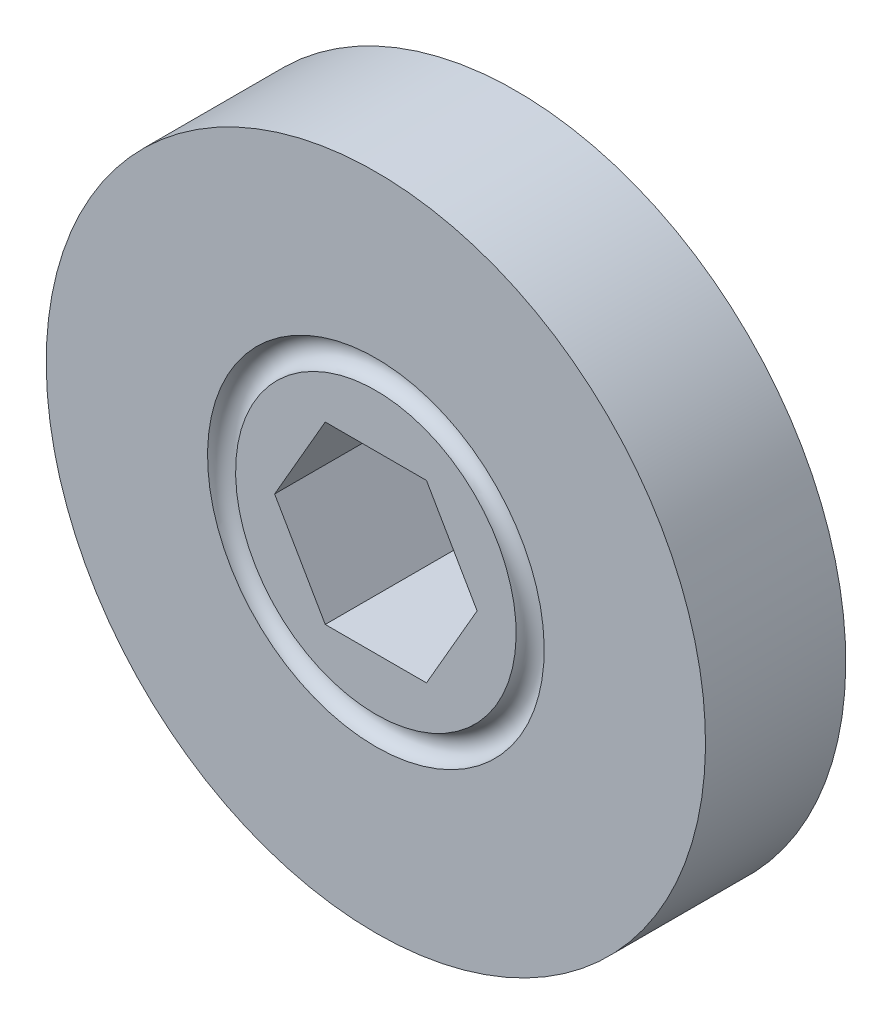
ISO-10303-21;
HEADER;
FILE_DESCRIPTION(('STEP AP214'),'2;1');
FILE_NAME('part.step','',(''),(''),'','','');
FILE_SCHEMA(('AUTOMOTIVE_DESIGN { 1 0 10303 214 1 1 1 1 }'));
ENDSEC;
DATA;
#1=APPLICATION_CONTEXT('core data for automotive mechanical design processes');
#2=APPLICATION_PROTOCOL_DEFINITION('international standard','automotive_design',2000,#1);
#3=PRODUCT_CONTEXT('',#1,'mechanical');
#4=PRODUCT('Part','Part','',(#3));
#5=PRODUCT_RELATED_PRODUCT_CATEGORY('part','',(#4));
#6=PRODUCT_DEFINITION_FORMATION('','',#4);
#7=PRODUCT_DEFINITION_CONTEXT('part definition',#1,'design');
#8=PRODUCT_DEFINITION('design','',#6,#7);
#9=PRODUCT_DEFINITION_SHAPE('','',#8);
#10=(LENGTH_UNIT() NAMED_UNIT(*) SI_UNIT(.MILLI.,.METRE.));
#11=(NAMED_UNIT(*) PLANE_ANGLE_UNIT() SI_UNIT($,.RADIAN.));
#12=(NAMED_UNIT(*) SI_UNIT($,.STERADIAN.) SOLID_ANGLE_UNIT());
#13=UNCERTAINTY_MEASURE_WITH_UNIT(LENGTH_MEASURE(1.E-05),#10,'distance_accuracy_value','');
#14=(GEOMETRIC_REPRESENTATION_CONTEXT(3) GLOBAL_UNCERTAINTY_ASSIGNED_CONTEXT((#13)) GLOBAL_UNIT_ASSIGNED_CONTEXT((#10,
#11,#12)) REPRESENTATION_CONTEXT('',''));
#15=CARTESIAN_POINT('',(0.,0.,0.));
#16=DIRECTION('',(0.,0.,1.));
#17=DIRECTION('',(1.,0.,0.));
#18=AXIS2_PLACEMENT_3D('',#15,#16,#17);
#19=CARTESIAN_POINT('',(0.,-0.253999999999998,-5.08));
#20=DIRECTION('',(0.,0.,-1.));
#21=DIRECTION('',(0.,1.,0.));
#22=AXIS2_PLACEMENT_3D('',#19,#20,#21);
#23=PLANE('',#22);
#24=CARTESIAN_POINT('',(0.,11.938,-5.08));
#25=DIRECTION('',(0.,0.,1.));
#26=DIRECTION('',(0.,-1.,0.));
#27=AXIS2_PLACEMENT_3D('',#24,#25,#26);
#28=CIRCLE('',#27,12.192);
#29=CARTESIAN_POINT('',(0.,-0.253999999999997,-5.08));
#30=VERTEX_POINT('',#29);
#31=EDGE_CURVE('E132',#30,#30,#28,.T.);
#32=ORIENTED_EDGE('',*,*,#31,.T.);
#33=EDGE_LOOP('',(#32));
#34=FACE_BOUND('',#33,.T.);
#35=CARTESIAN_POINT('',(0.,11.938,-5.08));
#36=DIRECTION('',(0.,0.,1.));
#37=DIRECTION('',(0.,-1.,0.));
#38=AXIS2_PLACEMENT_3D('',#35,#36,#37);
#39=CIRCLE('',#38,23.876);
#40=CARTESIAN_POINT('',(0.,-11.938,-5.08));
#41=VERTEX_POINT('',#40);
#42=EDGE_CURVE('E11',#41,#41,#39,.T.);
#43=ORIENTED_EDGE('',*,*,#42,.F.);
#44=EDGE_LOOP('',(#43));
#45=FACE_BOUND('',#44,.T.);
#46=ADVANCED_FACE('F33',(#34,#45),#23,.T.);
#47=CARTESIAN_POINT('',(0.,11.938,5.08));
#48=DIRECTION('',(0.,0.,1.));
#49=DIRECTION('',(0.,-1.,0.));
#50=AXIS2_PLACEMENT_3D('',#47,#48,#49);
#51=CYLINDRICAL_SURFACE('',#50,23.876);
#52=ORIENTED_EDGE('',*,*,#42,.T.);
#53=EDGE_LOOP('',(#52));
#54=FACE_BOUND('',#53,.T.);
#55=CARTESIAN_POINT('',(0.,11.938,5.08));
#56=DIRECTION('',(0.,0.,1.));
#57=DIRECTION('',(0.,-1.,0.));
#58=AXIS2_PLACEMENT_3D('',#55,#56,#57);
#59=CIRCLE('',#58,23.876);
#60=CARTESIAN_POINT('',(0.,-11.938,5.08));
#61=VERTEX_POINT('',#60);
#62=EDGE_CURVE('E40',#61,#61,#59,.T.);
#63=ORIENTED_EDGE('',*,*,#62,.F.);
#64=EDGE_LOOP('',(#63));
#65=FACE_BOUND('',#64,.T.);
#66=ADVANCED_FACE('F149',(#54,#65),#51,.T.);
#67=CARTESIAN_POINT('',(0.,-11.938,5.08));
#68=DIRECTION('',(0.,0.,1.));
#69=DIRECTION('',(0.,-1.,0.));
#70=AXIS2_PLACEMENT_3D('',#67,#68,#69);
#71=PLANE('',#70);
#72=ORIENTED_EDGE('',*,*,#62,.T.);
#73=EDGE_LOOP('',(#72));
#74=FACE_BOUND('',#73,.T.);
#75=CARTESIAN_POINT('',(0.,11.938,5.08));
#76=DIRECTION('',(0.,0.,1.));
#77=DIRECTION('',(0.,-1.,0.));
#78=AXIS2_PLACEMENT_3D('',#75,#76,#77);
#79=CIRCLE('',#78,12.192);
#80=CARTESIAN_POINT('',(0.,-0.253999999999999,5.08));
#81=VERTEX_POINT('',#80);
#82=EDGE_CURVE('E141',#81,#81,#79,.T.);
#83=ORIENTED_EDGE('',*,*,#82,.F.);
#84=EDGE_LOOP('',(#83));
#85=FACE_BOUND('',#84,.T.);
#86=ADVANCED_FACE('F146',(#74,#85),#71,.T.);
#87=CARTESIAN_POINT('',(0.,11.938,5.08));
#88=DIRECTION('',(0.,0.,1.));
#89=DIRECTION('',(0.,-1.,0.));
#90=AXIS2_PLACEMENT_3D('',#87,#88,#89);
#91=TOROIDAL_SURFACE('',#90,11.176,1.016);
#92=ORIENTED_EDGE('',*,*,#82,.T.);
#93=EDGE_LOOP('',(#92));
#94=FACE_BOUND('',#93,.T.);
#95=CARTESIAN_POINT('',(0.,11.938,5.08));
#96=DIRECTION('',(0.,0.,1.));
#97=DIRECTION('',(0.,-1.,0.));
#98=AXIS2_PLACEMENT_3D('',#95,#96,#97);
#99=CIRCLE('',#98,10.16);
#100=CARTESIAN_POINT('',(0.,1.778,5.08));
#101=VERTEX_POINT('',#100);
#102=EDGE_CURVE('E138',#101,#101,#99,.T.);
#103=ORIENTED_EDGE('',*,*,#102,.F.);
#104=EDGE_LOOP('',(#103));
#105=FACE_BOUND('',#104,.T.);
#106=ADVANCED_FACE('F156',(#94,#105),#91,.F.);
#107=CARTESIAN_POINT('',(0.,11.938,5.08));
#108=DIRECTION('',(0.,0.,1.));
#109=DIRECTION('',(0.,-1.,0.));
#110=AXIS2_PLACEMENT_3D('',#107,#108,#109);
#111=PLANE('',#110);
#112=DIRECTION('',(-0.5,0.866025403784439,0.));
#113=VECTOR('',#112,1.);
#114=CARTESIAN_POINT('',(7.33234841870825,11.938,5.08));
#115=LINE('',#114,#113);
#116=CARTESIAN_POINT('',(7.33234841870825,11.938,5.08));
#117=VERTEX_POINT('',#116);
#118=CARTESIAN_POINT('',(3.66617420935413,18.288,5.08));
#119=VERTEX_POINT('',#118);
#120=EDGE_CURVE('E102',#117,#119,#115,.T.);
#121=ORIENTED_EDGE('',*,*,#120,.F.);
#122=DIRECTION('',(0.5,0.866025403784439,0.));
#123=VECTOR('',#122,1.);
#124=CARTESIAN_POINT('',(3.66617420935412,5.58800000000003,5.08));
#125=LINE('',#124,#123);
#126=CARTESIAN_POINT('',(3.66617420935412,5.58800000000003,5.08));
#127=VERTEX_POINT('',#126);
#128=EDGE_CURVE('E114',#127,#117,#125,.T.);
#129=ORIENTED_EDGE('',*,*,#128,.F.);
#130=DIRECTION('',(1.,0.,0.));
#131=VECTOR('',#130,1.);
#132=CARTESIAN_POINT('',(-3.66617420935413,5.58800000000003,5.08));
#133=LINE('',#132,#131);
#134=CARTESIAN_POINT('',(-3.66617420935413,5.58800000000003,5.08));
#135=VERTEX_POINT('',#134);
#136=EDGE_CURVE('E47',#135,#127,#133,.T.);
#137=ORIENTED_EDGE('',*,*,#136,.F.);
#138=DIRECTION('',(0.5,-0.866025403784439,0.));
#139=VECTOR('',#138,1.);
#140=CARTESIAN_POINT('',(-7.33234841870825,11.938,5.08));
#141=LINE('',#140,#139);
#142=CARTESIAN_POINT('',(-7.33234841870825,11.938,5.08));
#143=VERTEX_POINT('',#142);
#144=EDGE_CURVE('E110',#143,#135,#141,.T.);
#145=ORIENTED_EDGE('',*,*,#144,.F.);
#146=DIRECTION('',(-0.5,-0.866025403784438,0.));
#147=VECTOR('',#146,1.);
#148=CARTESIAN_POINT('',(-3.66617420935413,18.288,5.08));
#149=LINE('',#148,#147);
#150=CARTESIAN_POINT('',(-3.66617420935413,18.288,5.08));
#151=VERTEX_POINT('',#150);
#152=EDGE_CURVE('E196',#151,#143,#149,.T.);
#153=ORIENTED_EDGE('',*,*,#152,.F.);
#154=DIRECTION('',(-1.,0.,0.));
#155=VECTOR('',#154,1.);
#156=CARTESIAN_POINT('',(3.66617420935413,18.288,5.08));
#157=LINE('',#156,#155);
#158=EDGE_CURVE('E195',#119,#151,#157,.T.);
#159=ORIENTED_EDGE('',*,*,#158,.F.);
#160=EDGE_LOOP('',(#121,#129,#137,#145,#153,#159));
#161=FACE_BOUND('',#160,.T.);
#162=ORIENTED_EDGE('',*,*,#102,.T.);
#163=EDGE_LOOP('',(#162));
#164=FACE_BOUND('',#163,.T.);
#165=ADVANCED_FACE('F162',(#161,#164),#111,.T.);
#166=CARTESIAN_POINT('',(0.,11.938,-5.08));
#167=DIRECTION('',(0.,0.,-1.));
#168=DIRECTION('',(0.,1.,0.));
#169=AXIS2_PLACEMENT_3D('',#166,#167,#168);
#170=PLANE('',#169);
#171=DIRECTION('',(-0.5,0.866025403784439,0.));
#172=VECTOR('',#171,1.);
#173=CARTESIAN_POINT('',(7.33234841870825,11.938,-5.08));
#174=LINE('',#173,#172);
#175=CARTESIAN_POINT('',(7.33234841870825,11.938,-5.08));
#176=VERTEX_POINT('',#175);
#177=CARTESIAN_POINT('',(3.66617420935413,18.288,-5.08));
#178=VERTEX_POINT('',#177);
#179=EDGE_CURVE('E99',#176,#178,#174,.T.);
#180=ORIENTED_EDGE('',*,*,#179,.T.);
#181=DIRECTION('',(-1.,0.,0.));
#182=VECTOR('',#181,1.);
#183=CARTESIAN_POINT('',(3.66617420935413,18.288,-5.08));
#184=LINE('',#183,#182);
#185=CARTESIAN_POINT('',(-3.66617420935413,18.288,-5.08));
#186=VERTEX_POINT('',#185);
#187=EDGE_CURVE('E86',#178,#186,#184,.T.);
#188=ORIENTED_EDGE('',*,*,#187,.T.);
#189=DIRECTION('',(-0.5,-0.866025403784439,0.));
#190=VECTOR('',#189,1.);
#191=CARTESIAN_POINT('',(-3.66617420935413,18.288,-5.08));
#192=LINE('',#191,#190);
#193=CARTESIAN_POINT('',(-7.33234841870825,11.938,-5.08));
#194=VERTEX_POINT('',#193);
#195=EDGE_CURVE('E125',#186,#194,#192,.T.);
#196=ORIENTED_EDGE('',*,*,#195,.T.);
#197=DIRECTION('',(0.5,-0.866025403784439,0.));
#198=VECTOR('',#197,1.);
#199=CARTESIAN_POINT('',(-7.33234841870825,11.938,-5.08));
#200=LINE('',#199,#198);
#201=CARTESIAN_POINT('',(-3.66617420935413,5.58800000000003,-5.08));
#202=VERTEX_POINT('',#201);
#203=EDGE_CURVE('E121',#194,#202,#200,.T.);
#204=ORIENTED_EDGE('',*,*,#203,.T.);
#205=DIRECTION('',(1.,0.,0.));
#206=VECTOR('',#205,1.);
#207=CARTESIAN_POINT('',(-3.66617420935413,5.58800000000003,-5.08));
#208=LINE('',#207,#206);
#209=CARTESIAN_POINT('',(3.66617420935412,5.58800000000003,-5.08));
#210=VERTEX_POINT('',#209);
#211=EDGE_CURVE('E118',#202,#210,#208,.T.);
#212=ORIENTED_EDGE('',*,*,#211,.T.);
#213=DIRECTION('',(0.5,0.866025403784439,0.));
#214=VECTOR('',#213,1.);
#215=CARTESIAN_POINT('',(3.66617420935412,5.58800000000003,-5.08));
#216=LINE('',#215,#214);
#217=EDGE_CURVE('E108',#210,#176,#216,.T.);
#218=ORIENTED_EDGE('',*,*,#217,.T.);
#219=EDGE_LOOP('',(#180,#188,#196,#204,#212,#218));
#220=FACE_BOUND('',#219,.T.);
#221=CARTESIAN_POINT('',(0.,11.938,-5.08));
#222=DIRECTION('',(0.,0.,1.));
#223=DIRECTION('',(0.,-1.,0.));
#224=AXIS2_PLACEMENT_3D('',#221,#222,#223);
#225=CIRCLE('',#224,10.16);
#226=CARTESIAN_POINT('',(0.,1.778,-5.08));
#227=VERTEX_POINT('',#226);
#228=EDGE_CURVE('E135',#227,#227,#225,.T.);
#229=ORIENTED_EDGE('',*,*,#228,.F.);
#230=EDGE_LOOP('',(#229));
#231=FACE_BOUND('',#230,.T.);
#232=ADVANCED_FACE('F105',(#220,#231),#170,.T.);
#233=CARTESIAN_POINT('',(0.,11.938,-5.08));
#234=DIRECTION('',(0.,0.,1.));
#235=DIRECTION('',(0.,-1.,0.));
#236=AXIS2_PLACEMENT_3D('',#233,#234,#235);
#237=TOROIDAL_SURFACE('',#236,11.176,1.016);
#238=ORIENTED_EDGE('',*,*,#228,.T.);
#239=EDGE_LOOP('',(#238));
#240=FACE_BOUND('',#239,.T.);
#241=ORIENTED_EDGE('',*,*,#31,.F.);
#242=EDGE_LOOP('',(#241));
#243=FACE_BOUND('',#242,.T.);
#244=ADVANCED_FACE('F169',(#240,#243),#237,.F.);
#245=CARTESIAN_POINT('',(7.33234841870825,11.938,-24.4795704419797));
#246=DIRECTION('',(0.866025403784439,0.5,0.));
#247=DIRECTION('',(-0.5,0.866025403784439,0.));
#248=AXIS2_PLACEMENT_3D('',#245,#246,#247);
#249=PLANE('',#248);
#250=DIRECTION('',(0.,0.,1.));
#251=VECTOR('',#250,1.);
#252=CARTESIAN_POINT('',(7.33234841870825,11.938,-24.4795704419797));
#253=LINE('',#252,#251);
#254=EDGE_CURVE('E55',#176,#117,#253,.T.);
#255=ORIENTED_EDGE('',*,*,#254,.T.);
#256=ORIENTED_EDGE('',*,*,#120,.T.);
#257=DIRECTION('',(0.,0.,1.));
#258=VECTOR('',#257,1.);
#259=CARTESIAN_POINT('',(3.66617420935413,18.288,-24.4795704419797));
#260=LINE('',#259,#258);
#261=EDGE_CURVE('E90',#178,#119,#260,.T.);
#262=ORIENTED_EDGE('',*,*,#261,.F.);
#263=ORIENTED_EDGE('',*,*,#179,.F.);
#264=EDGE_LOOP('',(#255,#256,#262,#263));
#265=FACE_BOUND('',#264,.T.);
#266=ADVANCED_FACE('F98',(#265),#249,.F.);
#267=CARTESIAN_POINT('',(3.66617420935413,18.288,-24.4795704419797));
#268=DIRECTION('',(0.,1.,0.));
#269=DIRECTION('',(0.,0.,1.));
#270=AXIS2_PLACEMENT_3D('',#267,#268,#269);
#271=PLANE('',#270);
#272=ORIENTED_EDGE('',*,*,#261,.T.);
#273=ORIENTED_EDGE('',*,*,#158,.T.);
#274=DIRECTION('',(0.,0.,1.));
#275=VECTOR('',#274,1.);
#276=CARTESIAN_POINT('',(-3.66617420935413,18.288,-24.4795704419797));
#277=LINE('',#276,#275);
#278=EDGE_CURVE('E92',#186,#151,#277,.T.);
#279=ORIENTED_EDGE('',*,*,#278,.F.);
#280=ORIENTED_EDGE('',*,*,#187,.F.);
#281=EDGE_LOOP('',(#272,#273,#279,#280));
#282=FACE_BOUND('',#281,.T.);
#283=ADVANCED_FACE('F88',(#282),#271,.F.);
#284=CARTESIAN_POINT('',(-3.66617420935413,18.288,-24.4795704419797));
#285=DIRECTION('',(-0.866025403784439,0.5,0.));
#286=DIRECTION('',(-0.5,-0.866025403784439,0.));
#287=AXIS2_PLACEMENT_3D('',#284,#285,#286);
#288=PLANE('',#287);
#289=ORIENTED_EDGE('',*,*,#278,.T.);
#290=ORIENTED_EDGE('',*,*,#152,.T.);
#291=DIRECTION('',(0.,0.,1.));
#292=VECTOR('',#291,1.);
#293=CARTESIAN_POINT('',(-7.33234841870825,11.938,-24.4795704419797));
#294=LINE('',#293,#292);
#295=EDGE_CURVE('E124',#194,#143,#294,.T.);
#296=ORIENTED_EDGE('',*,*,#295,.F.);
#297=ORIENTED_EDGE('',*,*,#195,.F.);
#298=EDGE_LOOP('',(#289,#290,#296,#297));
#299=FACE_BOUND('',#298,.T.);
#300=ADVANCED_FACE('F177',(#299),#288,.F.);
#301=CARTESIAN_POINT('',(-7.33234841870825,11.938,-24.4795704419797));
#302=DIRECTION('',(-0.866025403784439,-0.5,0.));
#303=DIRECTION('',(0.5,-0.866025403784439,0.));
#304=AXIS2_PLACEMENT_3D('',#301,#302,#303);
#305=PLANE('',#304);
#306=ORIENTED_EDGE('',*,*,#295,.T.);
#307=ORIENTED_EDGE('',*,*,#144,.T.);
#308=DIRECTION('',(0.,0.,1.));
#309=VECTOR('',#308,1.);
#310=CARTESIAN_POINT('',(-3.66617420935413,5.58800000000003,-24.4795704419797));
#311=LINE('',#310,#309);
#312=EDGE_CURVE('E120',#202,#135,#311,.T.);
#313=ORIENTED_EDGE('',*,*,#312,.F.);
#314=ORIENTED_EDGE('',*,*,#203,.F.);
#315=EDGE_LOOP('',(#306,#307,#313,#314));
#316=FACE_BOUND('',#315,.T.);
#317=ADVANCED_FACE('F180',(#316),#305,.F.);
#318=CARTESIAN_POINT('',(-3.66617420935413,5.58800000000003,-24.4795704419797));
#319=DIRECTION('',(0.,-1.,0.));
#320=DIRECTION('',(0.,0.,-1.));
#321=AXIS2_PLACEMENT_3D('',#318,#319,#320);
#322=PLANE('',#321);
#323=ORIENTED_EDGE('',*,*,#312,.T.);
#324=ORIENTED_EDGE('',*,*,#136,.T.);
#325=DIRECTION('',(0.,0.,1.));
#326=VECTOR('',#325,1.);
#327=CARTESIAN_POINT('',(3.66617420935412,5.58800000000003,-24.4795704419797));
#328=LINE('',#327,#326);
#329=EDGE_CURVE('E117',#210,#127,#328,.T.);
#330=ORIENTED_EDGE('',*,*,#329,.F.);
#331=ORIENTED_EDGE('',*,*,#211,.F.);
#332=EDGE_LOOP('',(#323,#324,#330,#331));
#333=FACE_BOUND('',#332,.T.);
#334=ADVANCED_FACE('F184',(#333),#322,.F.);
#335=CARTESIAN_POINT('',(3.66617420935412,5.58800000000003,-24.4795704419797));
#336=DIRECTION('',(0.866025403784439,-0.5,0.));
#337=DIRECTION('',(0.5,0.866025403784439,0.));
#338=AXIS2_PLACEMENT_3D('',#335,#336,#337);
#339=PLANE('',#338);
#340=ORIENTED_EDGE('',*,*,#329,.T.);
#341=ORIENTED_EDGE('',*,*,#128,.T.);
#342=ORIENTED_EDGE('',*,*,#254,.F.);
#343=ORIENTED_EDGE('',*,*,#217,.F.);
#344=EDGE_LOOP('',(#340,#341,#342,#343));
#345=FACE_BOUND('',#344,.T.);
#346=ADVANCED_FACE('F188',(#345),#339,.F.);
#347=CLOSED_SHELL('',(#46,#66,#86,#106,#165,#232,#244,#266,#283,#300,#317,#334,#346));
#348=MANIFOLD_SOLID_BREP('B2',#347);
#349=ADVANCED_BREP_SHAPE_REPRESENTATION('',(#18,#348),#14);
#350=SHAPE_DEFINITION_REPRESENTATION(#9,#349);
ENDSEC;
END-ISO-10303-21;
